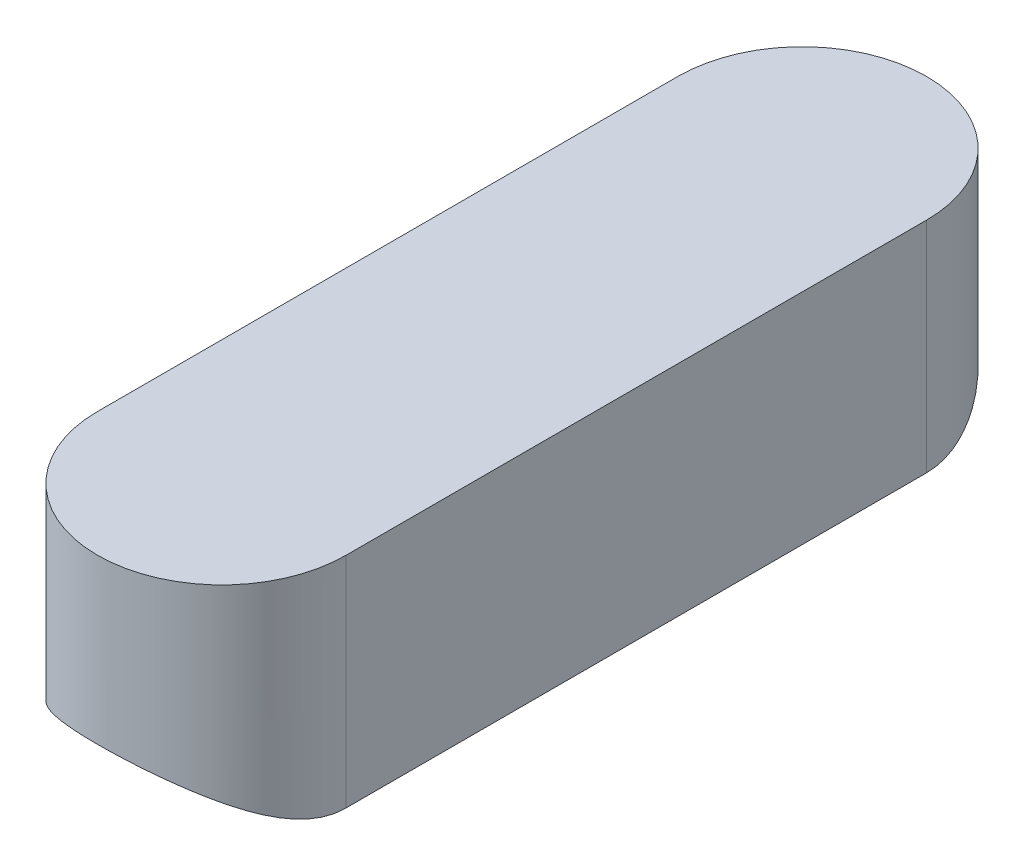
ISO-10303-21;
HEADER;
FILE_DESCRIPTION(('STEP AP214'),'2;1');
FILE_NAME('part.step','',(''),(''),'','','');
FILE_SCHEMA(('AUTOMOTIVE_DESIGN { 1 0 10303 214 1 1 1 1 }'));
ENDSEC;
DATA;
#1=APPLICATION_CONTEXT('core data for automotive mechanical design processes');
#2=APPLICATION_PROTOCOL_DEFINITION('international standard','automotive_design',2000,#1);
#3=PRODUCT_CONTEXT('',#1,'mechanical');
#4=PRODUCT('Part','Part','',(#3));
#5=PRODUCT_RELATED_PRODUCT_CATEGORY('part','',(#4));
#6=PRODUCT_DEFINITION_FORMATION('','',#4);
#7=PRODUCT_DEFINITION_CONTEXT('part definition',#1,'design');
#8=PRODUCT_DEFINITION('design','',#6,#7);
#9=PRODUCT_DEFINITION_SHAPE('','',#8);
#10=(LENGTH_UNIT() NAMED_UNIT(*) SI_UNIT(.MILLI.,.METRE.));
#11=(NAMED_UNIT(*) PLANE_ANGLE_UNIT() SI_UNIT($,.RADIAN.));
#12=(NAMED_UNIT(*) SI_UNIT($,.STERADIAN.) SOLID_ANGLE_UNIT());
#13=UNCERTAINTY_MEASURE_WITH_UNIT(LENGTH_MEASURE(1.E-05),#10,'distance_accuracy_value','');
#14=(GEOMETRIC_REPRESENTATION_CONTEXT(3) GLOBAL_UNCERTAINTY_ASSIGNED_CONTEXT((#13)) GLOBAL_UNIT_ASSIGNED_CONTEXT((#10,
#11,#12)) REPRESENTATION_CONTEXT('',''));
#15=CARTESIAN_POINT('',(0.,0.,0.));
#16=DIRECTION('',(0.,0.,1.));
#17=DIRECTION('',(1.,0.,0.));
#18=AXIS2_PLACEMENT_3D('',#15,#16,#17);
#19=CARTESIAN_POINT('',(0.,0.,20.));
#20=DIRECTION('',(0.,0.,-1.));
#21=DIRECTION('',(-1.,0.,0.));
#22=AXIS2_PLACEMENT_3D('',#19,#20,#21);
#23=CYLINDRICAL_SURFACE('',#22,4.05);
#24=CARTESIAN_POINT('',(3.,2.72075357208256,3.));
#25=CARTESIAN_POINT('',(3.00002247765262,2.72069902568503,2.92893320376957));
#26=CARTESIAN_POINT('',(2.9974758617934,2.72353662924895,2.85790350545384));
#27=CARTESIAN_POINT('',(2.98742856478572,2.73456916280723,2.71675055359261));
#28=CARTESIAN_POINT('',(2.97993767336919,2.74275350585888,2.64662578744384));
#29=CARTESIAN_POINT('',(2.96030761955829,2.76392301020885,2.50869301309107));
#30=CARTESIAN_POINT('',(2.94822749611531,2.77684712561423,2.4408670299539));
#31=CARTESIAN_POINT('',(2.91968140705288,2.80684745218199,2.30707661833072));
#32=CARTESIAN_POINT('',(2.90321345841608,2.82392554037055,2.24111304648038));
#33=CARTESIAN_POINT('',(2.84793349350689,2.8800177289747,2.04754165487975));
#34=CARTESIAN_POINT('',(2.80307107522808,2.92409137854406,1.92308432312553));
#35=CARTESIAN_POINT('',(2.69888349908819,3.02052769740338,1.68348791702301));
#36=CARTESIAN_POINT('',(2.63950627325069,3.07291996492057,1.56838442317043));
#37=CARTESIAN_POINT('',(2.494211183906,3.19247958347765,1.32587832367603));
#38=CARTESIAN_POINT('',(2.40535804601836,3.26050118363494,1.20064763296233));
#39=CARTESIAN_POINT('',(2.2095996147397,3.39623719674436,0.965012028377204));
#40=CARTESIAN_POINT('',(2.10268421019528,3.46395141570329,0.854615481065058));
#41=CARTESIAN_POINT('',(1.84834056934492,3.60712007978917,0.629822939550066));
#42=CARTESIAN_POINT('',(1.69708084852772,3.68146836432937,0.518929822979799));
#43=CARTESIAN_POINT('',(1.4532080787987,3.78132761032908,0.373759451926592));
#44=CARTESIAN_POINT('',(1.36911059068353,3.81266355824181,0.328906419536475));
#45=CARTESIAN_POINT('',(1.19569606355028,3.87054975626176,0.246910063098148));
#46=CARTESIAN_POINT('',(1.10638171899864,3.89710244844133,0.209762803421745));
#47=CARTESIAN_POINT('',(0.885804023557612,3.95418137046673,0.130489038663124));
#48=CARTESIAN_POINT('',(0.752275457909695,3.98191883662931,0.0925002213257056));
#49=CARTESIAN_POINT('',(0.479292556722913,4.02390655845004,0.0352565741056814));
#50=CARTESIAN_POINT('',(0.339843521647203,4.03816862293924,0.0159853411213476));
#51=CARTESIAN_POINT('',(0.0585161159748328,4.05202974609775,-0.00274654064949836));
#52=CARTESIAN_POINT('',(-0.0833674112794166,4.05159244116439,-0.00215806005341584));
#53=CARTESIAN_POINT('',(-0.364830529481161,4.03599796720371,0.0189215937252565));
#54=CARTESIAN_POINT('',(-0.504409552294933,4.02083722190101,0.0394176023812698));
#55=CARTESIAN_POINT('',(-0.772870540785369,3.97782350890289,0.0981107182208642));
#56=CARTESIAN_POINT('',(-0.901952002930496,3.95039314802819,0.135719106614987));
#57=CARTESIAN_POINT('',(-1.15156555052655,3.88497957233367,0.226633718677234));
#58=CARTESIAN_POINT('',(-1.27209574410578,3.84699403138209,0.279943402724298));
#59=CARTESIAN_POINT('',(-1.51553866935947,3.75821963464021,0.406931445910841));
#60=CARTESIAN_POINT('',(-1.63727105236138,3.70648501140562,0.482199545648349));
#61=CARTESIAN_POINT('',(-1.86694337142937,3.59628715583717,0.647432776052774));
#62=CARTESIAN_POINT('',(-1.97487171529223,3.53781834562987,0.737410116511653));
#63=CARTESIAN_POINT('',(-2.19579117958691,3.40596149277238,0.94908676457719));
#64=CARTESIAN_POINT('',(-2.30571612692857,3.3318767785237,1.07355491714972));
#65=CARTESIAN_POINT('',(-2.50417490654587,3.18540395841159,1.33967100546333));
#66=CARTESIAN_POINT('',(-2.59269126757848,3.11301728149953,1.48133283208785));
#67=CARTESIAN_POINT('',(-2.73062889302465,2.99211943211476,1.750370526451));
#68=CARTESIAN_POINT('',(-2.7843459963304,2.94175845855329,1.87470193189694));
#69=CARTESIAN_POINT('',(-2.87518758974592,2.8530391604764,2.1328923393347));
#70=CARTESIAN_POINT('',(-2.91238980396882,2.81462487280423,2.26670319930782));
#71=CARTESIAN_POINT('',(-2.95976876607783,2.76461277251129,2.50059787329489));
#72=CARTESIAN_POINT('',(-2.97470902658551,2.74842404823606,2.59871613943773));
#73=CARTESIAN_POINT('',(-2.98980689962204,2.73196023709044,2.74784407222458));
#74=CARTESIAN_POINT('',(-2.99362116201317,2.72777467280624,2.79808040751534));
#75=CARTESIAN_POINT('',(-2.99872079149347,2.72216458605804,2.89887187099824));
#76=CARTESIAN_POINT('',(-3.0000042506291,2.72074214670516,2.94942721090397));
#77=CARTESIAN_POINT('',(-3.,2.72075357208256,3.));
#78=B_SPLINE_CURVE_WITH_KNOTS('',3,(#24,#25,#26,#27,#28,#29,#30,#31,#32,#33,#34,#35,#36,#37,#38,
#39,#40,#41,#42,#43,#44,#45,#46,#47,#48,#49,#50,#51,#52,#53,#54,#55,#56,#57,#58,#59,#60,#61,#62,
#63,#64,#65,#66,#67,#68,#69,#70,#71,#72,#73,#74,#75,#76,#77),.UNSPECIFIED.,.F.,.F.,(4,2,2,2,2,2,
2,2,2,2,2,2,2,2,2,2,2,2,2,2,2,2,2,2,2,2,4),(0.,0.213038659511602,0.425656759950811,
0.635627462884799,0.845693220625009,1.26227494930912,1.68037356633086,2.18243291730941,
2.68477425520938,3.28615805951999,3.5866944003845,3.88707686603564,4.30984375738365,
4.73223982298961,5.15568089740224,5.57922484999389,5.98918653373689,6.39923863585546,
6.8541239282124,7.30938874541377,7.85280607751481,8.39666539961511,8.82878871269464,
9.25885618357108,9.55952855375888,9.71106423553019,9.86271411530131),.UNSPECIFIED.);
#79=CARTESIAN_POINT('',(3.,2.72075357208256,3.));
#80=VERTEX_POINT('',#79);
#81=CARTESIAN_POINT('',(-3.,2.72075357208256,3.));
#82=VERTEX_POINT('',#81);
#83=EDGE_CURVE('E56',#80,#82,#78,.T.);
#84=ORIENTED_EDGE('',*,*,#83,.F.);
#85=DIRECTION('',(0.,0.,-1.));
#86=VECTOR('',#85,1.);
#87=CARTESIAN_POINT('',(3.,2.72075357208256,20.));
#88=LINE('',#87,#86);
#89=CARTESIAN_POINT('',(3.,2.72075357208256,17.));
#90=VERTEX_POINT('',#89);
#91=EDGE_CURVE('E12',#90,#80,#88,.T.);
#92=ORIENTED_EDGE('',*,*,#91,.F.);
#93=CARTESIAN_POINT('',(-3.,2.72075357208256,17.));
#94=CARTESIAN_POINT('',(-3.00002247765262,2.72069902568503,17.0710667962304));
#95=CARTESIAN_POINT('',(-2.99747586179339,2.72353662924896,17.1420964945462));
#96=CARTESIAN_POINT('',(-2.98742856478571,2.73456916280724,17.2832494464074));
#97=CARTESIAN_POINT('',(-2.97993767336918,2.74275350585889,17.3533742125562));
#98=CARTESIAN_POINT('',(-2.96030761955829,2.76392301020886,17.4913069869089));
#99=CARTESIAN_POINT('',(-2.9482274961153,2.77684712561424,17.5591329700461));
#100=CARTESIAN_POINT('',(-2.91968140705288,2.80684745218199,17.6929233816693));
#101=CARTESIAN_POINT('',(-2.90321345841608,2.82392554037056,17.7588869535196));
#102=CARTESIAN_POINT('',(-2.84793349350689,2.8800177289747,17.9524583451202));
#103=CARTESIAN_POINT('',(-2.80307107522808,2.92409137854406,18.0769156768745));
#104=CARTESIAN_POINT('',(-2.69888349908819,3.02052769740339,18.316512082977));
#105=CARTESIAN_POINT('',(-2.63950627325069,3.07291996492057,18.4316155768296));
#106=CARTESIAN_POINT('',(-2.494211183906,3.19247958347765,18.674121676324));
#107=CARTESIAN_POINT('',(-2.40535804601836,3.26050118363494,18.7993523670377));
#108=CARTESIAN_POINT('',(-2.2095996147397,3.39623719674436,19.0349879716228));
#109=CARTESIAN_POINT('',(-2.10268421019528,3.4639514157033,19.1453845189349));
#110=CARTESIAN_POINT('',(-1.84834056934492,3.60712007978917,19.3701770604499));
#111=CARTESIAN_POINT('',(-1.69708084852772,3.68146836432936,19.4810701770202));
#112=CARTESIAN_POINT('',(-1.4532080787987,3.78132761032908,19.6262405480734));
#113=CARTESIAN_POINT('',(-1.36911059068353,3.81266355824181,19.6710935804635));
#114=CARTESIAN_POINT('',(-1.19569606355028,3.87054975626176,19.7530899369019));
#115=CARTESIAN_POINT('',(-1.10638171899864,3.89710244844133,19.7902371965783));
#116=CARTESIAN_POINT('',(-0.885804023557612,3.95418137046673,19.8695109613369));
#117=CARTESIAN_POINT('',(-0.752275457909693,3.98191883662931,19.9074997786743));
#118=CARTESIAN_POINT('',(-0.47929255672291,4.02390655845004,19.9647434258943));
#119=CARTESIAN_POINT('',(-0.339843521647201,4.03816862293924,19.9840146588787));
#120=CARTESIAN_POINT('',(-0.0585161159748312,4.05202974609775,20.0027465406495));
#121=CARTESIAN_POINT('',(0.0833674112794181,4.05159244116439,20.0021580600534));
#122=CARTESIAN_POINT('',(0.364830529481163,4.03599796720371,19.9810784062747));
#123=CARTESIAN_POINT('',(0.504409552294935,4.02083722190101,19.9605823976187));
#124=CARTESIAN_POINT('',(0.772870540785371,3.97782350890289,19.9018892817791));
#125=CARTESIAN_POINT('',(0.901952002930498,3.95039314802819,19.864280893385));
#126=CARTESIAN_POINT('',(1.15156555052655,3.88497957233367,19.7733662813228));
#127=CARTESIAN_POINT('',(1.27209574410578,3.84699403138209,19.7200565972757));
#128=CARTESIAN_POINT('',(1.51553866935947,3.75821963464021,19.5930685540892));
#129=CARTESIAN_POINT('',(1.63727105236138,3.70648501140562,19.5178004543517));
#130=CARTESIAN_POINT('',(1.86694337142937,3.59628715583717,19.3525672239472));
#131=CARTESIAN_POINT('',(1.97487171529223,3.53781834562987,19.2625898834883));
#132=CARTESIAN_POINT('',(2.19579117958691,3.40596149277238,19.0509132354228));
#133=CARTESIAN_POINT('',(2.30571612692858,3.3318767785237,18.9264450828503));
#134=CARTESIAN_POINT('',(2.50417490654587,3.18540395841159,18.6603289945367));
#135=CARTESIAN_POINT('',(2.59269126757848,3.11301728149953,18.5186671679122));
#136=CARTESIAN_POINT('',(2.73062889302465,2.99211943211476,18.249629473549));
#137=CARTESIAN_POINT('',(2.7843459963304,2.94175845855328,18.1252980681031));
#138=CARTESIAN_POINT('',(2.87518758974592,2.85303916047639,17.8671076606653));
#139=CARTESIAN_POINT('',(2.91238980396882,2.81462487280423,17.7332968006922));
#140=CARTESIAN_POINT('',(2.95976876607783,2.76461277251129,17.4994021267051));
#141=CARTESIAN_POINT('',(2.97470902658551,2.74842404823606,17.4012838605623));
#142=CARTESIAN_POINT('',(2.98980689962204,2.73196023709044,17.2521559277754));
#143=CARTESIAN_POINT('',(2.99362116201317,2.72777467280623,17.2019195924847));
#144=CARTESIAN_POINT('',(2.99872079149348,2.72216458605803,17.1011281290018));
#145=CARTESIAN_POINT('',(3.00000425062911,2.72074214670516,17.050572789096));
#146=CARTESIAN_POINT('',(3.,2.72075357208256,17.));
#147=B_SPLINE_CURVE_WITH_KNOTS('',3,(#93,#94,#95,#96,#97,#98,#99,#100,#101,#102,#103,#104,#105,
#106,#107,#108,#109,#110,#111,#112,#113,#114,#115,#116,#117,#118,#119,#120,#121,#122,#123,#124,
#125,#126,#127,#128,#129,#130,#131,#132,#133,#134,#135,#136,#137,#138,#139,#140,#141,#142,#143,
#144,#145,#146),.UNSPECIFIED.,.F.,.F.,(4,2,2,2,2,2,2,2,2,2,2,2,2,2,2,2,2,2,2,2,2,2,2,2,2,2,4),
(0.,0.213038659511609,0.425656759950811,0.635627462884797,0.845693220625007,1.26227494930912,
1.68037356633086,2.18243291730941,2.68477425520938,3.28615805951999,3.5866944003845,
3.88707686603563,4.30984375738365,4.73223982298961,5.15568089740224,5.57922484999389,
5.98918653373688,6.39923863585545,6.8541239282124,7.30938874541377,7.8528060775148,
8.39666539961511,8.82878871269463,9.25885618357108,9.55952855375888,9.71106423553019,
9.86271411530131),.UNSPECIFIED.);
#148=CARTESIAN_POINT('',(-3.,2.72075357208256,17.));
#149=VERTEX_POINT('',#148);
#150=EDGE_CURVE('E73',#149,#90,#147,.T.);
#151=ORIENTED_EDGE('',*,*,#150,.F.);
#152=DIRECTION('',(0.,0.,-1.));
#153=VECTOR('',#152,1.);
#154=CARTESIAN_POINT('',(-3.,2.72075357208256,20.));
#155=LINE('',#154,#153);
#156=EDGE_CURVE('E83',#149,#82,#155,.T.);
#157=ORIENTED_EDGE('',*,*,#156,.T.);
#158=EDGE_LOOP('',(#84,#92,#151,#157));
#159=FACE_BOUND('',#158,.T.);
#160=ADVANCED_FACE('F33',(#159),#23,.F.);
#161=CARTESIAN_POINT('',(3.,2.72075357208256,20.));
#162=DIRECTION('',(-1.,0.,0.));
#163=DIRECTION('',(0.,0.,1.));
#164=AXIS2_PLACEMENT_3D('',#161,#162,#163);
#165=PLANE('',#164);
#166=ORIENTED_EDGE('',*,*,#91,.T.);
#167=DIRECTION('',(0.,1.,0.));
#168=VECTOR('',#167,1.);
#169=CARTESIAN_POINT('',(3.,2.72075357208256,3.));
#170=LINE('',#169,#168);
#171=CARTESIAN_POINT('',(3.,8.,3.));
#172=VERTEX_POINT('',#171);
#173=EDGE_CURVE('E89',#80,#172,#170,.T.);
#174=ORIENTED_EDGE('',*,*,#173,.T.);
#175=DIRECTION('',(0.,0.,-1.));
#176=VECTOR('',#175,1.);
#177=CARTESIAN_POINT('',(3.,8.,20.));
#178=LINE('',#177,#176);
#179=CARTESIAN_POINT('',(3.,8.,17.));
#180=VERTEX_POINT('',#179);
#181=EDGE_CURVE('E41',#180,#172,#178,.T.);
#182=ORIENTED_EDGE('',*,*,#181,.F.);
#183=DIRECTION('',(0.,1.,0.));
#184=VECTOR('',#183,1.);
#185=CARTESIAN_POINT('',(3.,2.72075357208256,17.));
#186=LINE('',#185,#184);
#187=EDGE_CURVE('E76',#90,#180,#186,.T.);
#188=ORIENTED_EDGE('',*,*,#187,.F.);
#189=EDGE_LOOP('',(#166,#174,#182,#188));
#190=FACE_BOUND('',#189,.T.);
#191=ADVANCED_FACE('F86',(#190),#165,.F.);
#192=CARTESIAN_POINT('',(3.,8.,20.));
#193=DIRECTION('',(0.,-1.,0.));
#194=DIRECTION('',(0.,0.,-1.));
#195=AXIS2_PLACEMENT_3D('',#192,#193,#194);
#196=PLANE('',#195);
#197=CARTESIAN_POINT('',(0.,8.,3.));
#198=DIRECTION('',(0.,1.,0.));
#199=DIRECTION('',(0.,0.,1.));
#200=AXIS2_PLACEMENT_3D('',#197,#198,#199);
#201=CIRCLE('',#200,3.);
#202=CARTESIAN_POINT('',(-3.,8.,3.));
#203=VERTEX_POINT('',#202);
#204=EDGE_CURVE('E157',#172,#203,#201,.T.);
#205=ORIENTED_EDGE('',*,*,#204,.T.);
#206=DIRECTION('',(0.,0.,-1.));
#207=VECTOR('',#206,1.);
#208=CARTESIAN_POINT('',(-3.,8.,20.));
#209=LINE('',#208,#207);
#210=CARTESIAN_POINT('',(-3.,8.,17.));
#211=VERTEX_POINT('',#210);
#212=EDGE_CURVE('E159',#211,#203,#209,.T.);
#213=ORIENTED_EDGE('',*,*,#212,.F.);
#214=CARTESIAN_POINT('',(0.,8.,17.));
#215=DIRECTION('',(0.,1.,0.));
#216=DIRECTION('',(0.,0.,1.));
#217=AXIS2_PLACEMENT_3D('',#214,#215,#216);
#218=CIRCLE('',#217,3.);
#219=EDGE_CURVE('E48',#211,#180,#218,.T.);
#220=ORIENTED_EDGE('',*,*,#219,.T.);
#221=ORIENTED_EDGE('',*,*,#181,.T.);
#222=EDGE_LOOP('',(#205,#213,#220,#221));
#223=FACE_BOUND('',#222,.T.);
#224=ADVANCED_FACE('F113',(#223),#196,.F.);
#225=CARTESIAN_POINT('',(-3.,2.72075357208256,20.));
#226=DIRECTION('',(1.,0.,0.));
#227=DIRECTION('',(0.,0.,-1.));
#228=AXIS2_PLACEMENT_3D('',#225,#226,#227);
#229=PLANE('',#228);
#230=DIRECTION('',(0.,1.,0.));
#231=VECTOR('',#230,1.);
#232=CARTESIAN_POINT('',(-3.,2.72075357208256,3.));
#233=LINE('',#232,#231);
#234=EDGE_CURVE('E98',#82,#203,#233,.T.);
#235=ORIENTED_EDGE('',*,*,#234,.F.);
#236=ORIENTED_EDGE('',*,*,#156,.F.);
#237=DIRECTION('',(0.,1.,0.));
#238=VECTOR('',#237,1.);
#239=CARTESIAN_POINT('',(-3.,2.72075357208256,17.));
#240=LINE('',#239,#238);
#241=EDGE_CURVE('E78',#149,#211,#240,.T.);
#242=ORIENTED_EDGE('',*,*,#241,.T.);
#243=ORIENTED_EDGE('',*,*,#212,.T.);
#244=EDGE_LOOP('',(#235,#236,#242,#243));
#245=FACE_BOUND('',#244,.T.);
#246=ADVANCED_FACE('F110',(#245),#229,.F.);
#247=CARTESIAN_POINT('',(0.,2.72075357208256,17.));
#248=DIRECTION('',(0.,1.,0.));
#249=DIRECTION('',(0.,0.,1.));
#250=AXIS2_PLACEMENT_3D('',#247,#248,#249);
#251=CYLINDRICAL_SURFACE('',#250,3.);
#252=ORIENTED_EDGE('',*,*,#150,.T.);
#253=ORIENTED_EDGE('',*,*,#187,.T.);
#254=ORIENTED_EDGE('',*,*,#219,.F.);
#255=ORIENTED_EDGE('',*,*,#241,.F.);
#256=EDGE_LOOP('',(#252,#253,#254,#255));
#257=FACE_BOUND('',#256,.T.);
#258=ADVANCED_FACE('F75',(#257),#251,.T.);
#259=CARTESIAN_POINT('',(0.,2.72075357208256,3.));
#260=DIRECTION('',(0.,1.,0.));
#261=DIRECTION('',(0.,0.,1.));
#262=AXIS2_PLACEMENT_3D('',#259,#260,#261);
#263=CYLINDRICAL_SURFACE('',#262,3.);
#264=ORIENTED_EDGE('',*,*,#83,.T.);
#265=ORIENTED_EDGE('',*,*,#234,.T.);
#266=ORIENTED_EDGE('',*,*,#204,.F.);
#267=ORIENTED_EDGE('',*,*,#173,.F.);
#268=EDGE_LOOP('',(#264,#265,#266,#267));
#269=FACE_BOUND('',#268,.T.);
#270=ADVANCED_FACE('F105',(#269),#263,.T.);
#271=CLOSED_SHELL('',(#160,#191,#224,#246,#258,#270));
#272=MANIFOLD_SOLID_BREP('B2',#271);
#273=ADVANCED_BREP_SHAPE_REPRESENTATION('',(#18,#272),#14);
#274=SHAPE_DEFINITION_REPRESENTATION(#9,#273);
ENDSEC;
END-ISO-10303-21;
